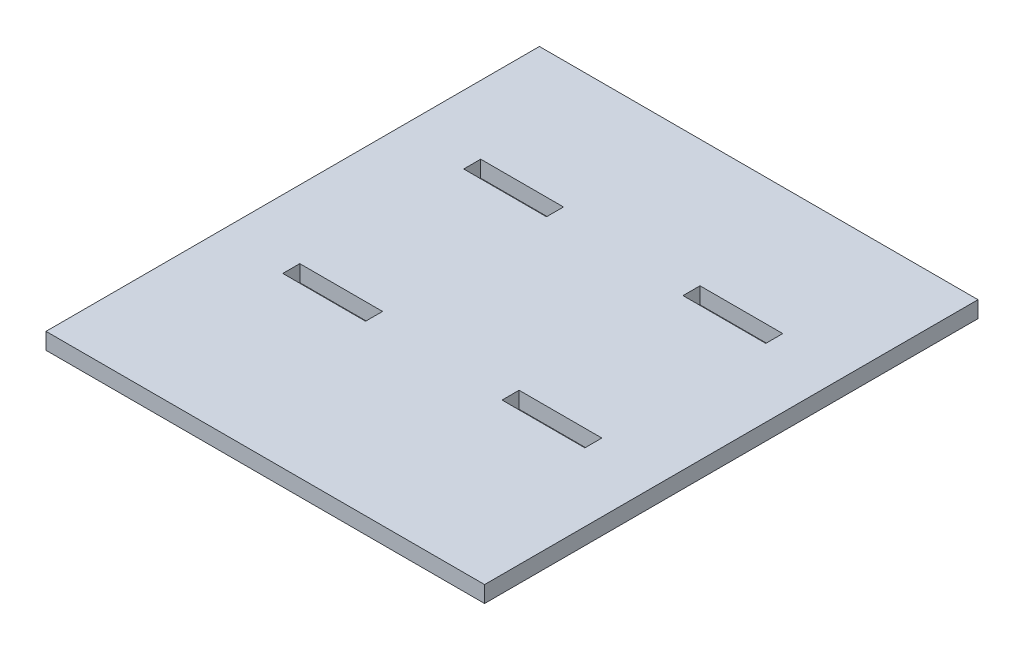
ISO-10303-21;
HEADER;
FILE_DESCRIPTION(('STEP AP214'),'2;1');
FILE_NAME('part.step','',(''),(''),'','','');
FILE_SCHEMA(('AUTOMOTIVE_DESIGN { 1 0 10303 214 1 1 1 1 }'));
ENDSEC;
DATA;
#1=APPLICATION_CONTEXT('core data for automotive mechanical design processes');
#2=APPLICATION_PROTOCOL_DEFINITION('international standard','automotive_design',2000,#1);
#3=PRODUCT_CONTEXT('',#1,'mechanical');
#4=PRODUCT('Part','Part','',(#3));
#5=PRODUCT_RELATED_PRODUCT_CATEGORY('part','',(#4));
#6=PRODUCT_DEFINITION_FORMATION('','',#4);
#7=PRODUCT_DEFINITION_CONTEXT('part definition',#1,'design');
#8=PRODUCT_DEFINITION('design','',#6,#7);
#9=PRODUCT_DEFINITION_SHAPE('','',#8);
#10=(LENGTH_UNIT() NAMED_UNIT(*) SI_UNIT(.MILLI.,.METRE.));
#11=(NAMED_UNIT(*) PLANE_ANGLE_UNIT() SI_UNIT($,.RADIAN.));
#12=(NAMED_UNIT(*) SI_UNIT($,.STERADIAN.) SOLID_ANGLE_UNIT());
#13=UNCERTAINTY_MEASURE_WITH_UNIT(LENGTH_MEASURE(1.E-05),#10,'distance_accuracy_value','');
#14=(GEOMETRIC_REPRESENTATION_CONTEXT(3) GLOBAL_UNCERTAINTY_ASSIGNED_CONTEXT((#13)) GLOBAL_UNIT_ASSIGNED_CONTEXT((#10,
#11,#12)) REPRESENTATION_CONTEXT('',''));
#15=CARTESIAN_POINT('',(0.,0.,0.));
#16=DIRECTION('',(0.,0.,1.));
#17=DIRECTION('',(1.,0.,0.));
#18=AXIS2_PLACEMENT_3D('',#15,#16,#17);
#19=CARTESIAN_POINT('',(0.,3.,0.));
#20=DIRECTION('',(0.,-1.,0.));
#21=DIRECTION('',(0.,0.,-1.));
#22=AXIS2_PLACEMENT_3D('',#19,#20,#21);
#23=PLANE('',#22);
#24=DIRECTION('',(0.,0.,-1.));
#25=VECTOR('',#24,1.);
#26=CARTESIAN_POINT('',(67.55,3.,-33.84));
#27=LINE('',#26,#25);
#28=CARTESIAN_POINT('',(67.55,3.,-30.74));
#29=VERTEX_POINT('',#28);
#30=CARTESIAN_POINT('',(67.55,3.,-33.84));
#31=VERTEX_POINT('',#30);
#32=EDGE_CURVE('E212',#29,#31,#27,.T.);
#33=ORIENTED_EDGE('',*,*,#32,.F.);
#34=DIRECTION('',(1.,0.,0.));
#35=VECTOR('',#34,1.);
#36=CARTESIAN_POINT('',(67.55,3.,-30.74));
#37=LINE('',#36,#35);
#38=CARTESIAN_POINT('',(52.45,3.,-30.74));
#39=VERTEX_POINT('',#38);
#40=EDGE_CURVE('E220',#39,#29,#37,.T.);
#41=ORIENTED_EDGE('',*,*,#40,.F.);
#42=DIRECTION('',(0.,0.,1.));
#43=VECTOR('',#42,1.);
#44=CARTESIAN_POINT('',(52.45,3.,-33.84));
#45=LINE('',#44,#43);
#46=CARTESIAN_POINT('',(52.45,3.,-33.84));
#47=VERTEX_POINT('',#46);
#48=EDGE_CURVE('E217',#47,#39,#45,.T.);
#49=ORIENTED_EDGE('',*,*,#48,.F.);
#50=DIRECTION('',(-1.,0.,0.));
#51=VECTOR('',#50,1.);
#52=CARTESIAN_POINT('',(67.55,3.,-33.84));
#53=LINE('',#52,#51);
#54=EDGE_CURVE('E214',#31,#47,#53,.T.);
#55=ORIENTED_EDGE('',*,*,#54,.F.);
#56=EDGE_LOOP('',(#33,#41,#49,#55));
#57=FACE_BOUND('',#56,.T.);
#58=DIRECTION('',(0.,0.,1.));
#59=VECTOR('',#58,1.);
#60=CARTESIAN_POINT('',(12.45,3.,-33.84));
#61=LINE('',#60,#59);
#62=CARTESIAN_POINT('',(12.45,3.,-33.84));
#63=VERTEX_POINT('',#62);
#64=CARTESIAN_POINT('',(12.45,3.,-30.74));
#65=VERTEX_POINT('',#64);
#66=EDGE_CURVE('E274',#63,#65,#61,.T.);
#67=ORIENTED_EDGE('',*,*,#66,.F.);
#68=DIRECTION('',(-1.,0.,0.));
#69=VECTOR('',#68,1.);
#70=CARTESIAN_POINT('',(12.45,3.,-33.84));
#71=LINE('',#70,#69);
#72=CARTESIAN_POINT('',(27.55,3.,-33.84));
#73=VERTEX_POINT('',#72);
#74=EDGE_CURVE('E282',#73,#63,#71,.T.);
#75=ORIENTED_EDGE('',*,*,#74,.F.);
#76=DIRECTION('',(0.,0.,-1.));
#77=VECTOR('',#76,1.);
#78=CARTESIAN_POINT('',(27.55,3.,-33.84));
#79=LINE('',#78,#77);
#80=CARTESIAN_POINT('',(27.55,3.,-30.74));
#81=VERTEX_POINT('',#80);
#82=EDGE_CURVE('E279',#81,#73,#79,.T.);
#83=ORIENTED_EDGE('',*,*,#82,.F.);
#84=DIRECTION('',(1.,0.,0.));
#85=VECTOR('',#84,1.);
#86=CARTESIAN_POINT('',(12.45,3.,-30.74));
#87=LINE('',#86,#85);
#88=EDGE_CURVE('E276',#65,#81,#87,.T.);
#89=ORIENTED_EDGE('',*,*,#88,.F.);
#90=EDGE_LOOP('',(#67,#75,#83,#89));
#91=FACE_BOUND('',#90,.T.);
#92=DIRECTION('',(0.,0.,1.));
#93=VECTOR('',#92,1.);
#94=CARTESIAN_POINT('',(0.,3.,0.));
#95=LINE('',#94,#93);
#96=CARTESIAN_POINT('',(0.,3.,-90.));
#97=VERTEX_POINT('',#96);
#98=CARTESIAN_POINT('',(0.,3.,0.));
#99=VERTEX_POINT('',#98);
#100=EDGE_CURVE('E305',#97,#99,#95,.T.);
#101=ORIENTED_EDGE('',*,*,#100,.T.);
#102=DIRECTION('',(1.,0.,0.));
#103=VECTOR('',#102,1.);
#104=CARTESIAN_POINT('',(0.,3.,0.));
#105=LINE('',#104,#103);
#106=CARTESIAN_POINT('',(80.,3.,0.));
#107=VERTEX_POINT('',#106);
#108=EDGE_CURVE('E308',#99,#107,#105,.T.);
#109=ORIENTED_EDGE('',*,*,#108,.T.);
#110=DIRECTION('',(0.,0.,-1.));
#111=VECTOR('',#110,1.);
#112=CARTESIAN_POINT('',(80.,3.,0.));
#113=LINE('',#112,#111);
#114=CARTESIAN_POINT('',(80.,3.,-90.));
#115=VERTEX_POINT('',#114);
#116=EDGE_CURVE('E311',#107,#115,#113,.T.);
#117=ORIENTED_EDGE('',*,*,#116,.T.);
#118=DIRECTION('',(-1.,0.,0.));
#119=VECTOR('',#118,1.);
#120=CARTESIAN_POINT('',(0.,3.,-90.));
#121=LINE('',#120,#119);
#122=EDGE_CURVE('E313',#115,#97,#121,.T.);
#123=ORIENTED_EDGE('',*,*,#122,.T.);
#124=EDGE_LOOP('',(#101,#109,#117,#123));
#125=FACE_BOUND('',#124,.T.);
#126=DIRECTION('',(0.,0.,1.));
#127=VECTOR('',#126,1.);
#128=CARTESIAN_POINT('',(12.45,3.,-66.84));
#129=LINE('',#128,#127);
#130=CARTESIAN_POINT('',(12.45,3.,-66.84));
#131=VERTEX_POINT('',#130);
#132=CARTESIAN_POINT('',(12.45,3.,-63.74));
#133=VERTEX_POINT('',#132);
#134=EDGE_CURVE('E243',#131,#133,#129,.T.);
#135=ORIENTED_EDGE('',*,*,#134,.F.);
#136=DIRECTION('',(-1.,0.,0.));
#137=VECTOR('',#136,1.);
#138=CARTESIAN_POINT('',(12.45,3.,-66.84));
#139=LINE('',#138,#137);
#140=CARTESIAN_POINT('',(27.55,3.,-66.84));
#141=VERTEX_POINT('',#140);
#142=EDGE_CURVE('E251',#141,#131,#139,.T.);
#143=ORIENTED_EDGE('',*,*,#142,.F.);
#144=DIRECTION('',(0.,0.,-1.));
#145=VECTOR('',#144,1.);
#146=CARTESIAN_POINT('',(27.55,3.,-66.84));
#147=LINE('',#146,#145);
#148=CARTESIAN_POINT('',(27.55,3.,-63.74));
#149=VERTEX_POINT('',#148);
#150=EDGE_CURVE('E248',#149,#141,#147,.T.);
#151=ORIENTED_EDGE('',*,*,#150,.F.);
#152=DIRECTION('',(1.,0.,0.));
#153=VECTOR('',#152,1.);
#154=CARTESIAN_POINT('',(12.45,3.,-63.74));
#155=LINE('',#154,#153);
#156=EDGE_CURVE('E245',#133,#149,#155,.T.);
#157=ORIENTED_EDGE('',*,*,#156,.F.);
#158=EDGE_LOOP('',(#135,#143,#151,#157));
#159=FACE_BOUND('',#158,.T.);
#160=DIRECTION('',(0.,0.,-1.));
#161=VECTOR('',#160,1.);
#162=CARTESIAN_POINT('',(67.55,3.,-66.84));
#163=LINE('',#162,#161);
#164=CARTESIAN_POINT('',(67.55,3.,-63.74));
#165=VERTEX_POINT('',#164);
#166=CARTESIAN_POINT('',(67.55,3.,-66.84));
#167=VERTEX_POINT('',#166);
#168=EDGE_CURVE('E176',#165,#167,#163,.T.);
#169=ORIENTED_EDGE('',*,*,#168,.F.);
#170=DIRECTION('',(1.,0.,0.));
#171=VECTOR('',#170,1.);
#172=CARTESIAN_POINT('',(67.55,3.,-63.74));
#173=LINE('',#172,#171);
#174=CARTESIAN_POINT('',(52.45,3.,-63.74));
#175=VERTEX_POINT('',#174);
#176=EDGE_CURVE('E198',#175,#165,#173,.T.);
#177=ORIENTED_EDGE('',*,*,#176,.F.);
#178=DIRECTION('',(0.,0.,1.));
#179=VECTOR('',#178,1.);
#180=CARTESIAN_POINT('',(52.45,3.,-66.84));
#181=LINE('',#180,#179);
#182=CARTESIAN_POINT('',(52.45,3.,-66.84));
#183=VERTEX_POINT('',#182);
#184=EDGE_CURVE('E196',#183,#175,#181,.T.);
#185=ORIENTED_EDGE('',*,*,#184,.F.);
#186=DIRECTION('',(-1.,0.,0.));
#187=VECTOR('',#186,1.);
#188=CARTESIAN_POINT('',(67.55,3.,-66.84));
#189=LINE('',#188,#187);
#190=EDGE_CURVE('E184',#167,#183,#189,.T.);
#191=ORIENTED_EDGE('',*,*,#190,.F.);
#192=EDGE_LOOP('',(#169,#177,#185,#191));
#193=FACE_BOUND('',#192,.T.);
#194=ADVANCED_FACE('F39',(#57,#91,#125,#159,#193),#23,.F.);
#195=CARTESIAN_POINT('',(0.,0.,0.));
#196=DIRECTION('',(0.,-1.,0.));
#197=DIRECTION('',(0.,0.,-1.));
#198=AXIS2_PLACEMENT_3D('',#195,#196,#197);
#199=PLANE('',#198);
#200=DIRECTION('',(0.,0.,1.));
#201=VECTOR('',#200,1.);
#202=CARTESIAN_POINT('',(0.,0.,0.));
#203=LINE('',#202,#201);
#204=CARTESIAN_POINT('',(0.,0.,-90.));
#205=VERTEX_POINT('',#204);
#206=CARTESIAN_POINT('',(0.,0.,0.));
#207=VERTEX_POINT('',#206);
#208=EDGE_CURVE('E304',#205,#207,#203,.T.);
#209=ORIENTED_EDGE('',*,*,#208,.F.);
#210=DIRECTION('',(-1.,0.,0.));
#211=VECTOR('',#210,1.);
#212=CARTESIAN_POINT('',(0.,0.,-90.));
#213=LINE('',#212,#211);
#214=CARTESIAN_POINT('',(80.,0.,-90.));
#215=VERTEX_POINT('',#214);
#216=EDGE_CURVE('E309',#215,#205,#213,.T.);
#217=ORIENTED_EDGE('',*,*,#216,.F.);
#218=DIRECTION('',(0.,0.,-1.));
#219=VECTOR('',#218,1.);
#220=CARTESIAN_POINT('',(80.,0.,0.));
#221=LINE('',#220,#219);
#222=CARTESIAN_POINT('',(80.,0.,0.));
#223=VERTEX_POINT('',#222);
#224=EDGE_CURVE('E320',#223,#215,#221,.T.);
#225=ORIENTED_EDGE('',*,*,#224,.F.);
#226=DIRECTION('',(1.,0.,0.));
#227=VECTOR('',#226,1.);
#228=CARTESIAN_POINT('',(0.,0.,0.));
#229=LINE('',#228,#227);
#230=EDGE_CURVE('E318',#207,#223,#229,.T.);
#231=ORIENTED_EDGE('',*,*,#230,.F.);
#232=EDGE_LOOP('',(#209,#217,#225,#231));
#233=FACE_BOUND('',#232,.T.);
#234=DIRECTION('',(-1.,0.,0.));
#235=VECTOR('',#234,1.);
#236=CARTESIAN_POINT('',(12.45,0.,-33.84));
#237=LINE('',#236,#235);
#238=CARTESIAN_POINT('',(27.55,0.,-33.84));
#239=VERTEX_POINT('',#238);
#240=CARTESIAN_POINT('',(12.45,0.,-33.84));
#241=VERTEX_POINT('',#240);
#242=EDGE_CURVE('E277',#239,#241,#237,.T.);
#243=ORIENTED_EDGE('',*,*,#242,.T.);
#244=DIRECTION('',(0.,0.,1.));
#245=VECTOR('',#244,1.);
#246=CARTESIAN_POINT('',(12.45,0.,-33.84));
#247=LINE('',#246,#245);
#248=CARTESIAN_POINT('',(12.45,0.,-30.74));
#249=VERTEX_POINT('',#248);
#250=EDGE_CURVE('E273',#241,#249,#247,.T.);
#251=ORIENTED_EDGE('',*,*,#250,.T.);
#252=DIRECTION('',(1.,0.,0.));
#253=VECTOR('',#252,1.);
#254=CARTESIAN_POINT('',(12.45,0.,-30.74));
#255=LINE('',#254,#253);
#256=CARTESIAN_POINT('',(27.55,0.,-30.74));
#257=VERTEX_POINT('',#256);
#258=EDGE_CURVE('E287',#249,#257,#255,.T.);
#259=ORIENTED_EDGE('',*,*,#258,.T.);
#260=DIRECTION('',(0.,0.,-1.));
#261=VECTOR('',#260,1.);
#262=CARTESIAN_POINT('',(27.55,0.,-33.84));
#263=LINE('',#262,#261);
#264=EDGE_CURVE('E290',#257,#239,#263,.T.);
#265=ORIENTED_EDGE('',*,*,#264,.T.);
#266=EDGE_LOOP('',(#243,#251,#259,#265));
#267=FACE_BOUND('',#266,.T.);
#268=DIRECTION('',(-1.,0.,0.));
#269=VECTOR('',#268,1.);
#270=CARTESIAN_POINT('',(12.45,0.,-66.84));
#271=LINE('',#270,#269);
#272=CARTESIAN_POINT('',(27.55,0.,-66.84));
#273=VERTEX_POINT('',#272);
#274=CARTESIAN_POINT('',(12.45,0.,-66.84));
#275=VERTEX_POINT('',#274);
#276=EDGE_CURVE('E246',#273,#275,#271,.T.);
#277=ORIENTED_EDGE('',*,*,#276,.T.);
#278=DIRECTION('',(0.,0.,1.));
#279=VECTOR('',#278,1.);
#280=CARTESIAN_POINT('',(12.45,0.,-66.84));
#281=LINE('',#280,#279);
#282=CARTESIAN_POINT('',(12.45,0.,-63.74));
#283=VERTEX_POINT('',#282);
#284=EDGE_CURVE('E242',#275,#283,#281,.T.);
#285=ORIENTED_EDGE('',*,*,#284,.T.);
#286=DIRECTION('',(1.,0.,0.));
#287=VECTOR('',#286,1.);
#288=CARTESIAN_POINT('',(12.45,0.,-63.74));
#289=LINE('',#288,#287);
#290=CARTESIAN_POINT('',(27.55,0.,-63.74));
#291=VERTEX_POINT('',#290);
#292=EDGE_CURVE('E256',#283,#291,#289,.T.);
#293=ORIENTED_EDGE('',*,*,#292,.T.);
#294=DIRECTION('',(0.,0.,-1.));
#295=VECTOR('',#294,1.);
#296=CARTESIAN_POINT('',(27.55,0.,-66.84));
#297=LINE('',#296,#295);
#298=EDGE_CURVE('E259',#291,#273,#297,.T.);
#299=ORIENTED_EDGE('',*,*,#298,.T.);
#300=EDGE_LOOP('',(#277,#285,#293,#299));
#301=FACE_BOUND('',#300,.T.);
#302=DIRECTION('',(1.,0.,0.));
#303=VECTOR('',#302,1.);
#304=CARTESIAN_POINT('',(67.55,0.,-30.74));
#305=LINE('',#304,#303);
#306=CARTESIAN_POINT('',(52.45,0.,-30.74));
#307=VERTEX_POINT('',#306);
#308=CARTESIAN_POINT('',(67.55,0.,-30.74));
#309=VERTEX_POINT('',#308);
#310=EDGE_CURVE('E215',#307,#309,#305,.T.);
#311=ORIENTED_EDGE('',*,*,#310,.T.);
#312=DIRECTION('',(0.,0.,-1.));
#313=VECTOR('',#312,1.);
#314=CARTESIAN_POINT('',(67.55,0.,-33.84));
#315=LINE('',#314,#313);
#316=CARTESIAN_POINT('',(67.55,0.,-33.84));
#317=VERTEX_POINT('',#316);
#318=EDGE_CURVE('E192',#309,#317,#315,.T.);
#319=ORIENTED_EDGE('',*,*,#318,.T.);
#320=DIRECTION('',(-1.,0.,0.));
#321=VECTOR('',#320,1.);
#322=CARTESIAN_POINT('',(67.55,0.,-33.84));
#323=LINE('',#322,#321);
#324=CARTESIAN_POINT('',(52.45,0.,-33.84));
#325=VERTEX_POINT('',#324);
#326=EDGE_CURVE('E225',#317,#325,#323,.T.);
#327=ORIENTED_EDGE('',*,*,#326,.T.);
#328=DIRECTION('',(0.,0.,1.));
#329=VECTOR('',#328,1.);
#330=CARTESIAN_POINT('',(52.45,0.,-33.84));
#331=LINE('',#330,#329);
#332=EDGE_CURVE('E228',#325,#307,#331,.T.);
#333=ORIENTED_EDGE('',*,*,#332,.T.);
#334=EDGE_LOOP('',(#311,#319,#327,#333));
#335=FACE_BOUND('',#334,.T.);
#336=DIRECTION('',(1.,0.,0.));
#337=VECTOR('',#336,1.);
#338=CARTESIAN_POINT('',(67.55,0.,-63.74));
#339=LINE('',#338,#337);
#340=CARTESIAN_POINT('',(52.45,0.,-63.74));
#341=VERTEX_POINT('',#340);
#342=CARTESIAN_POINT('',(67.55,0.,-63.74));
#343=VERTEX_POINT('',#342);
#344=EDGE_CURVE('E185',#341,#343,#339,.T.);
#345=ORIENTED_EDGE('',*,*,#344,.T.);
#346=DIRECTION('',(0.,0.,-1.));
#347=VECTOR('',#346,1.);
#348=CARTESIAN_POINT('',(67.55,0.,-66.84));
#349=LINE('',#348,#347);
#350=CARTESIAN_POINT('',(67.55,0.,-66.84));
#351=VERTEX_POINT('',#350);
#352=EDGE_CURVE('E62',#343,#351,#349,.T.);
#353=ORIENTED_EDGE('',*,*,#352,.T.);
#354=DIRECTION('',(-1.,0.,0.));
#355=VECTOR('',#354,1.);
#356=CARTESIAN_POINT('',(67.55,0.,-66.84));
#357=LINE('',#356,#355);
#358=CARTESIAN_POINT('',(52.45,0.,-66.84));
#359=VERTEX_POINT('',#358);
#360=EDGE_CURVE('E191',#351,#359,#357,.T.);
#361=ORIENTED_EDGE('',*,*,#360,.T.);
#362=DIRECTION('',(0.,0.,1.));
#363=VECTOR('',#362,1.);
#364=CARTESIAN_POINT('',(52.45,0.,-66.84));
#365=LINE('',#364,#363);
#366=EDGE_CURVE('E204',#359,#341,#365,.T.);
#367=ORIENTED_EDGE('',*,*,#366,.T.);
#368=EDGE_LOOP('',(#345,#353,#361,#367));
#369=FACE_BOUND('',#368,.T.);
#370=ADVANCED_FACE('F338',(#233,#267,#301,#335,#369),#199,.T.);
#371=CARTESIAN_POINT('',(0.,3.,0.));
#372=DIRECTION('',(1.,0.,0.));
#373=DIRECTION('',(0.,0.,-1.));
#374=AXIS2_PLACEMENT_3D('',#371,#372,#373);
#375=PLANE('',#374);
#376=ORIENTED_EDGE('',*,*,#208,.T.);
#377=DIRECTION('',(0.,-1.,0.));
#378=VECTOR('',#377,1.);
#379=CARTESIAN_POINT('',(0.,3.,0.));
#380=LINE('',#379,#378);
#381=EDGE_CURVE('E11',#99,#207,#380,.T.);
#382=ORIENTED_EDGE('',*,*,#381,.F.);
#383=ORIENTED_EDGE('',*,*,#100,.F.);
#384=DIRECTION('',(0.,-1.,0.));
#385=VECTOR('',#384,1.);
#386=CARTESIAN_POINT('',(0.,3.,-90.));
#387=LINE('',#386,#385);
#388=EDGE_CURVE('E315',#97,#205,#387,.T.);
#389=ORIENTED_EDGE('',*,*,#388,.T.);
#390=EDGE_LOOP('',(#376,#382,#383,#389));
#391=FACE_BOUND('',#390,.T.);
#392=ADVANCED_FACE('F41',(#391),#375,.F.);
#393=CARTESIAN_POINT('',(0.,3.,0.));
#394=DIRECTION('',(0.,0.,-1.));
#395=DIRECTION('',(-1.,0.,0.));
#396=AXIS2_PLACEMENT_3D('',#393,#394,#395);
#397=PLANE('',#396);
#398=ORIENTED_EDGE('',*,*,#230,.T.);
#399=DIRECTION('',(0.,-1.,0.));
#400=VECTOR('',#399,1.);
#401=CARTESIAN_POINT('',(80.,3.,0.));
#402=LINE('',#401,#400);
#403=EDGE_CURVE('E47',#107,#223,#402,.T.);
#404=ORIENTED_EDGE('',*,*,#403,.F.);
#405=ORIENTED_EDGE('',*,*,#108,.F.);
#406=ORIENTED_EDGE('',*,*,#381,.T.);
#407=EDGE_LOOP('',(#398,#404,#405,#406));
#408=FACE_BOUND('',#407,.T.);
#409=ADVANCED_FACE('F349',(#408),#397,.F.);
#410=CARTESIAN_POINT('',(80.,3.,0.));
#411=DIRECTION('',(-1.,0.,0.));
#412=DIRECTION('',(0.,0.,1.));
#413=AXIS2_PLACEMENT_3D('',#410,#411,#412);
#414=PLANE('',#413);
#415=ORIENTED_EDGE('',*,*,#224,.T.);
#416=DIRECTION('',(0.,-1.,0.));
#417=VECTOR('',#416,1.);
#418=CARTESIAN_POINT('',(80.,3.,-90.));
#419=LINE('',#418,#417);
#420=EDGE_CURVE('E325',#115,#215,#419,.T.);
#421=ORIENTED_EDGE('',*,*,#420,.F.);
#422=ORIENTED_EDGE('',*,*,#116,.F.);
#423=ORIENTED_EDGE('',*,*,#403,.T.);
#424=EDGE_LOOP('',(#415,#421,#422,#423));
#425=FACE_BOUND('',#424,.T.);
#426=ADVANCED_FACE('F332',(#425),#414,.F.);
#427=CARTESIAN_POINT('',(0.,3.,-90.));
#428=DIRECTION('',(0.,0.,1.));
#429=DIRECTION('',(1.,0.,0.));
#430=AXIS2_PLACEMENT_3D('',#427,#428,#429);
#431=PLANE('',#430);
#432=ORIENTED_EDGE('',*,*,#216,.T.);
#433=ORIENTED_EDGE('',*,*,#388,.F.);
#434=ORIENTED_EDGE('',*,*,#122,.F.);
#435=ORIENTED_EDGE('',*,*,#420,.T.);
#436=EDGE_LOOP('',(#432,#433,#434,#435));
#437=FACE_BOUND('',#436,.T.);
#438=ADVANCED_FACE('F342',(#437),#431,.F.);
#439=CARTESIAN_POINT('',(12.45,3.,-33.84));
#440=DIRECTION('',(1.,0.,0.));
#441=DIRECTION('',(0.,0.,-1.));
#442=AXIS2_PLACEMENT_3D('',#439,#440,#441);
#443=PLANE('',#442);
#444=ORIENTED_EDGE('',*,*,#250,.F.);
#445=DIRECTION('',(0.,-1.,0.));
#446=VECTOR('',#445,1.);
#447=CARTESIAN_POINT('',(12.45,3.,-33.84));
#448=LINE('',#447,#446);
#449=EDGE_CURVE('E284',#63,#241,#448,.T.);
#450=ORIENTED_EDGE('',*,*,#449,.F.);
#451=ORIENTED_EDGE('',*,*,#66,.T.);
#452=DIRECTION('',(0.,-1.,0.));
#453=VECTOR('',#452,1.);
#454=CARTESIAN_POINT('',(12.45,3.,-30.74));
#455=LINE('',#454,#453);
#456=EDGE_CURVE('E301',#65,#249,#455,.T.);
#457=ORIENTED_EDGE('',*,*,#456,.T.);
#458=EDGE_LOOP('',(#444,#450,#451,#457));
#459=FACE_BOUND('',#458,.T.);
#460=ADVANCED_FACE('F366',(#459),#443,.T.);
#461=CARTESIAN_POINT('',(12.45,3.,-30.74));
#462=DIRECTION('',(0.,0.,-1.));
#463=DIRECTION('',(-1.,0.,0.));
#464=AXIS2_PLACEMENT_3D('',#461,#462,#463);
#465=PLANE('',#464);
#466=ORIENTED_EDGE('',*,*,#258,.F.);
#467=ORIENTED_EDGE('',*,*,#456,.F.);
#468=ORIENTED_EDGE('',*,*,#88,.T.);
#469=DIRECTION('',(0.,-1.,0.));
#470=VECTOR('',#469,1.);
#471=CARTESIAN_POINT('',(27.55,3.,-30.74));
#472=LINE('',#471,#470);
#473=EDGE_CURVE('E299',#81,#257,#472,.T.);
#474=ORIENTED_EDGE('',*,*,#473,.T.);
#475=EDGE_LOOP('',(#466,#467,#468,#474));
#476=FACE_BOUND('',#475,.T.);
#477=ADVANCED_FACE('F373',(#476),#465,.T.);
#478=CARTESIAN_POINT('',(27.55,3.,-33.84));
#479=DIRECTION('',(-1.,0.,0.));
#480=DIRECTION('',(0.,0.,1.));
#481=AXIS2_PLACEMENT_3D('',#478,#479,#480);
#482=PLANE('',#481);
#483=ORIENTED_EDGE('',*,*,#264,.F.);
#484=ORIENTED_EDGE('',*,*,#473,.F.);
#485=ORIENTED_EDGE('',*,*,#82,.T.);
#486=DIRECTION('',(0.,-1.,0.));
#487=VECTOR('',#486,1.);
#488=CARTESIAN_POINT('',(27.55,3.,-33.84));
#489=LINE('',#488,#487);
#490=EDGE_CURVE('E297',#73,#239,#489,.T.);
#491=ORIENTED_EDGE('',*,*,#490,.T.);
#492=EDGE_LOOP('',(#483,#484,#485,#491));
#493=FACE_BOUND('',#492,.T.);
#494=ADVANCED_FACE('F378',(#493),#482,.T.);
#495=CARTESIAN_POINT('',(12.45,3.,-33.84));
#496=DIRECTION('',(0.,0.,1.));
#497=DIRECTION('',(1.,0.,0.));
#498=AXIS2_PLACEMENT_3D('',#495,#496,#497);
#499=PLANE('',#498);
#500=ORIENTED_EDGE('',*,*,#242,.F.);
#501=ORIENTED_EDGE('',*,*,#490,.F.);
#502=ORIENTED_EDGE('',*,*,#74,.T.);
#503=ORIENTED_EDGE('',*,*,#449,.T.);
#504=EDGE_LOOP('',(#500,#501,#502,#503));
#505=FACE_BOUND('',#504,.T.);
#506=ADVANCED_FACE('F385',(#505),#499,.T.);
#507=CARTESIAN_POINT('',(12.45,3.,-66.84));
#508=DIRECTION('',(1.,0.,0.));
#509=DIRECTION('',(0.,0.,-1.));
#510=AXIS2_PLACEMENT_3D('',#507,#508,#509);
#511=PLANE('',#510);
#512=ORIENTED_EDGE('',*,*,#284,.F.);
#513=DIRECTION('',(0.,-1.,0.));
#514=VECTOR('',#513,1.);
#515=CARTESIAN_POINT('',(12.45,3.,-66.84));
#516=LINE('',#515,#514);
#517=EDGE_CURVE('E253',#131,#275,#516,.T.);
#518=ORIENTED_EDGE('',*,*,#517,.F.);
#519=ORIENTED_EDGE('',*,*,#134,.T.);
#520=DIRECTION('',(0.,-1.,0.));
#521=VECTOR('',#520,1.);
#522=CARTESIAN_POINT('',(12.45,3.,-63.74));
#523=LINE('',#522,#521);
#524=EDGE_CURVE('E270',#133,#283,#523,.T.);
#525=ORIENTED_EDGE('',*,*,#524,.T.);
#526=EDGE_LOOP('',(#512,#518,#519,#525));
#527=FACE_BOUND('',#526,.T.);
#528=ADVANCED_FACE('F398',(#527),#511,.T.);
#529=CARTESIAN_POINT('',(12.45,3.,-63.74));
#530=DIRECTION('',(0.,0.,-1.));
#531=DIRECTION('',(-1.,0.,0.));
#532=AXIS2_PLACEMENT_3D('',#529,#530,#531);
#533=PLANE('',#532);
#534=ORIENTED_EDGE('',*,*,#292,.F.);
#535=ORIENTED_EDGE('',*,*,#524,.F.);
#536=ORIENTED_EDGE('',*,*,#156,.T.);
#537=DIRECTION('',(0.,-1.,0.));
#538=VECTOR('',#537,1.);
#539=CARTESIAN_POINT('',(27.55,3.,-63.74));
#540=LINE('',#539,#538);
#541=EDGE_CURVE('E268',#149,#291,#540,.T.);
#542=ORIENTED_EDGE('',*,*,#541,.T.);
#543=EDGE_LOOP('',(#534,#535,#536,#542));
#544=FACE_BOUND('',#543,.T.);
#545=ADVANCED_FACE('F403',(#544),#533,.T.);
#546=CARTESIAN_POINT('',(27.55,3.,-66.84));
#547=DIRECTION('',(-1.,0.,0.));
#548=DIRECTION('',(0.,0.,1.));
#549=AXIS2_PLACEMENT_3D('',#546,#547,#548);
#550=PLANE('',#549);
#551=ORIENTED_EDGE('',*,*,#298,.F.);
#552=ORIENTED_EDGE('',*,*,#541,.F.);
#553=ORIENTED_EDGE('',*,*,#150,.T.);
#554=DIRECTION('',(0.,-1.,0.));
#555=VECTOR('',#554,1.);
#556=CARTESIAN_POINT('',(27.55,3.,-66.84));
#557=LINE('',#556,#555);
#558=EDGE_CURVE('E266',#141,#273,#557,.T.);
#559=ORIENTED_EDGE('',*,*,#558,.T.);
#560=EDGE_LOOP('',(#551,#552,#553,#559));
#561=FACE_BOUND('',#560,.T.);
#562=ADVANCED_FACE('F407',(#561),#550,.T.);
#563=CARTESIAN_POINT('',(12.45,3.,-66.84));
#564=DIRECTION('',(0.,0.,1.));
#565=DIRECTION('',(1.,0.,0.));
#566=AXIS2_PLACEMENT_3D('',#563,#564,#565);
#567=PLANE('',#566);
#568=ORIENTED_EDGE('',*,*,#276,.F.);
#569=ORIENTED_EDGE('',*,*,#558,.F.);
#570=ORIENTED_EDGE('',*,*,#142,.T.);
#571=ORIENTED_EDGE('',*,*,#517,.T.);
#572=EDGE_LOOP('',(#568,#569,#570,#571));
#573=FACE_BOUND('',#572,.T.);
#574=ADVANCED_FACE('F411',(#573),#567,.T.);
#575=CARTESIAN_POINT('',(67.55,3.,-33.84));
#576=DIRECTION('',(-1.,0.,0.));
#577=DIRECTION('',(0.,0.,1.));
#578=AXIS2_PLACEMENT_3D('',#575,#576,#577);
#579=PLANE('',#578);
#580=ORIENTED_EDGE('',*,*,#318,.F.);
#581=DIRECTION('',(0.,-1.,0.));
#582=VECTOR('',#581,1.);
#583=CARTESIAN_POINT('',(67.55,3.,-30.74));
#584=LINE('',#583,#582);
#585=EDGE_CURVE('E222',#29,#309,#584,.T.);
#586=ORIENTED_EDGE('',*,*,#585,.F.);
#587=ORIENTED_EDGE('',*,*,#32,.T.);
#588=DIRECTION('',(0.,-1.,0.));
#589=VECTOR('',#588,1.);
#590=CARTESIAN_POINT('',(67.55,3.,-33.84));
#591=LINE('',#590,#589);
#592=EDGE_CURVE('E239',#31,#317,#591,.T.);
#593=ORIENTED_EDGE('',*,*,#592,.T.);
#594=EDGE_LOOP('',(#580,#586,#587,#593));
#595=FACE_BOUND('',#594,.T.);
#596=ADVANCED_FACE('F415',(#595),#579,.T.);
#597=CARTESIAN_POINT('',(67.55,3.,-33.84));
#598=DIRECTION('',(0.,0.,1.));
#599=DIRECTION('',(1.,0.,0.));
#600=AXIS2_PLACEMENT_3D('',#597,#598,#599);
#601=PLANE('',#600);
#602=ORIENTED_EDGE('',*,*,#326,.F.);
#603=ORIENTED_EDGE('',*,*,#592,.F.);
#604=ORIENTED_EDGE('',*,*,#54,.T.);
#605=DIRECTION('',(0.,-1.,0.));
#606=VECTOR('',#605,1.);
#607=CARTESIAN_POINT('',(52.45,3.,-33.84));
#608=LINE('',#607,#606);
#609=EDGE_CURVE('E237',#47,#325,#608,.T.);
#610=ORIENTED_EDGE('',*,*,#609,.T.);
#611=EDGE_LOOP('',(#602,#603,#604,#610));
#612=FACE_BOUND('',#611,.T.);
#613=ADVANCED_FACE('F419',(#612),#601,.T.);
#614=CARTESIAN_POINT('',(52.45,3.,-33.84));
#615=DIRECTION('',(1.,0.,0.));
#616=DIRECTION('',(0.,0.,-1.));
#617=AXIS2_PLACEMENT_3D('',#614,#615,#616);
#618=PLANE('',#617);
#619=ORIENTED_EDGE('',*,*,#332,.F.);
#620=ORIENTED_EDGE('',*,*,#609,.F.);
#621=ORIENTED_EDGE('',*,*,#48,.T.);
#622=DIRECTION('',(0.,-1.,0.));
#623=VECTOR('',#622,1.);
#624=CARTESIAN_POINT('',(52.45,3.,-30.74));
#625=LINE('',#624,#623);
#626=EDGE_CURVE('E235',#39,#307,#625,.T.);
#627=ORIENTED_EDGE('',*,*,#626,.T.);
#628=EDGE_LOOP('',(#619,#620,#621,#627));
#629=FACE_BOUND('',#628,.T.);
#630=ADVANCED_FACE('F423',(#629),#618,.T.);
#631=CARTESIAN_POINT('',(67.55,3.,-30.74));
#632=DIRECTION('',(0.,0.,-1.));
#633=DIRECTION('',(-1.,0.,0.));
#634=AXIS2_PLACEMENT_3D('',#631,#632,#633);
#635=PLANE('',#634);
#636=ORIENTED_EDGE('',*,*,#310,.F.);
#637=ORIENTED_EDGE('',*,*,#626,.F.);
#638=ORIENTED_EDGE('',*,*,#40,.T.);
#639=ORIENTED_EDGE('',*,*,#585,.T.);
#640=EDGE_LOOP('',(#636,#637,#638,#639));
#641=FACE_BOUND('',#640,.T.);
#642=ADVANCED_FACE('F427',(#641),#635,.T.);
#643=CARTESIAN_POINT('',(67.55,3.,-66.84));
#644=DIRECTION('',(-1.,0.,0.));
#645=DIRECTION('',(0.,0.,1.));
#646=AXIS2_PLACEMENT_3D('',#643,#644,#645);
#647=PLANE('',#646);
#648=ORIENTED_EDGE('',*,*,#352,.F.);
#649=DIRECTION('',(0.,-1.,0.));
#650=VECTOR('',#649,1.);
#651=CARTESIAN_POINT('',(67.55,3.,-63.74));
#652=LINE('',#651,#650);
#653=EDGE_CURVE('E180',#165,#343,#652,.T.);
#654=ORIENTED_EDGE('',*,*,#653,.F.);
#655=ORIENTED_EDGE('',*,*,#168,.T.);
#656=DIRECTION('',(0.,-1.,0.));
#657=VECTOR('',#656,1.);
#658=CARTESIAN_POINT('',(67.55,3.,-66.84));
#659=LINE('',#658,#657);
#660=EDGE_CURVE('E179',#167,#351,#659,.T.);
#661=ORIENTED_EDGE('',*,*,#660,.T.);
#662=EDGE_LOOP('',(#648,#654,#655,#661));
#663=FACE_BOUND('',#662,.T.);
#664=ADVANCED_FACE('F178',(#663),#647,.T.);
#665=CARTESIAN_POINT('',(67.55,3.,-66.84));
#666=DIRECTION('',(0.,0.,1.));
#667=DIRECTION('',(1.,0.,0.));
#668=AXIS2_PLACEMENT_3D('',#665,#666,#667);
#669=PLANE('',#668);
#670=ORIENTED_EDGE('',*,*,#360,.F.);
#671=ORIENTED_EDGE('',*,*,#660,.F.);
#672=ORIENTED_EDGE('',*,*,#190,.T.);
#673=DIRECTION('',(0.,-1.,0.));
#674=VECTOR('',#673,1.);
#675=CARTESIAN_POINT('',(52.45,3.,-66.84));
#676=LINE('',#675,#674);
#677=EDGE_CURVE('E193',#183,#359,#676,.T.);
#678=ORIENTED_EDGE('',*,*,#677,.T.);
#679=EDGE_LOOP('',(#670,#671,#672,#678));
#680=FACE_BOUND('',#679,.T.);
#681=ADVANCED_FACE('F188',(#680),#669,.T.);
#682=CARTESIAN_POINT('',(52.45,3.,-66.84));
#683=DIRECTION('',(1.,0.,0.));
#684=DIRECTION('',(0.,0.,-1.));
#685=AXIS2_PLACEMENT_3D('',#682,#683,#684);
#686=PLANE('',#685);
#687=ORIENTED_EDGE('',*,*,#366,.F.);
#688=ORIENTED_EDGE('',*,*,#677,.F.);
#689=ORIENTED_EDGE('',*,*,#184,.T.);
#690=DIRECTION('',(0.,-1.,0.));
#691=VECTOR('',#690,1.);
#692=CARTESIAN_POINT('',(52.45,3.,-63.74));
#693=LINE('',#692,#691);
#694=EDGE_CURVE('E54',#175,#341,#693,.T.);
#695=ORIENTED_EDGE('',*,*,#694,.T.);
#696=EDGE_LOOP('',(#687,#688,#689,#695));
#697=FACE_BOUND('',#696,.T.);
#698=ADVANCED_FACE('F436',(#697),#686,.T.);
#699=CARTESIAN_POINT('',(67.55,3.,-63.74));
#700=DIRECTION('',(0.,0.,-1.));
#701=DIRECTION('',(-1.,0.,0.));
#702=AXIS2_PLACEMENT_3D('',#699,#700,#701);
#703=PLANE('',#702);
#704=ORIENTED_EDGE('',*,*,#344,.F.);
#705=ORIENTED_EDGE('',*,*,#694,.F.);
#706=ORIENTED_EDGE('',*,*,#176,.T.);
#707=ORIENTED_EDGE('',*,*,#653,.T.);
#708=EDGE_LOOP('',(#704,#705,#706,#707));
#709=FACE_BOUND('',#708,.T.);
#710=ADVANCED_FACE('F439',(#709),#703,.T.);
#711=CLOSED_SHELL('',(#194,#370,#392,#409,#426,#438,#460,#477,#494,#506,#528,#545,#562,#574,
#596,#613,#630,#642,#664,#681,#698,#710));
#712=MANIFOLD_SOLID_BREP('B2',#711);
#713=ADVANCED_BREP_SHAPE_REPRESENTATION('',(#18,#712),#14);
#714=SHAPE_DEFINITION_REPRESENTATION(#9,#713);
ENDSEC;
END-ISO-10303-21;
